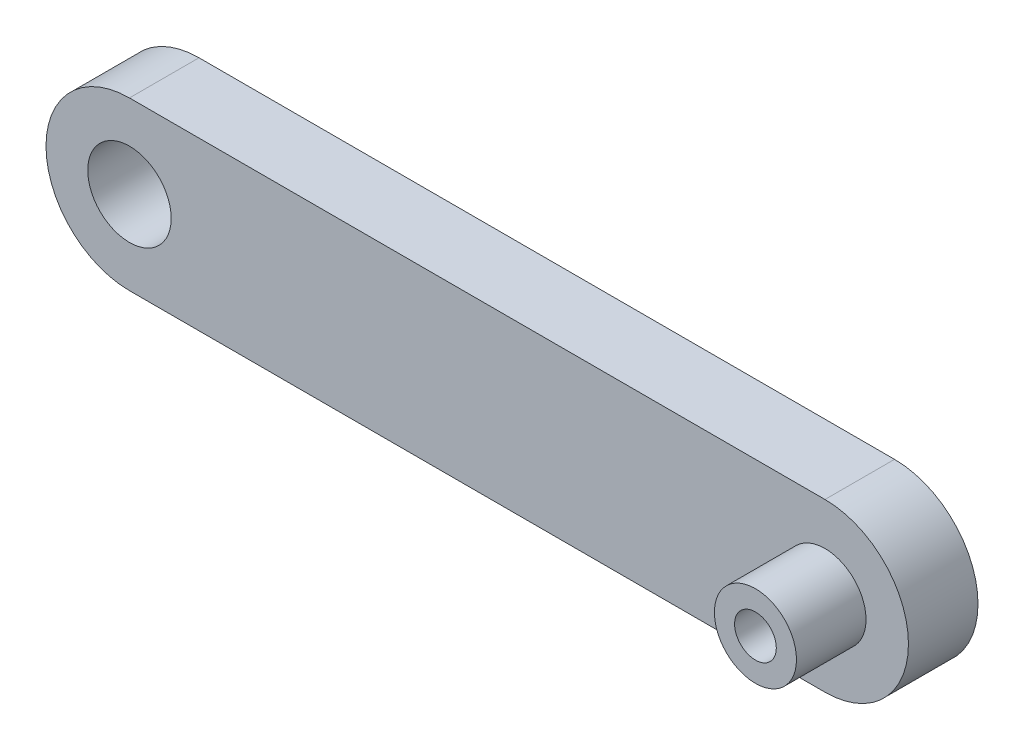
ISO-10303-21;
HEADER;
FILE_DESCRIPTION(('STEP AP214'),'2;1');
FILE_NAME('part.step','',(''),(''),'','','');
FILE_SCHEMA(('AUTOMOTIVE_DESIGN { 1 0 10303 214 1 1 1 1 }'));
ENDSEC;
DATA;
#1=APPLICATION_CONTEXT('core data for automotive mechanical design processes');
#2=APPLICATION_PROTOCOL_DEFINITION('international standard','automotive_design',2000,#1);
#3=PRODUCT_CONTEXT('',#1,'mechanical');
#4=PRODUCT('Part','Part','',(#3));
#5=PRODUCT_RELATED_PRODUCT_CATEGORY('part','',(#4));
#6=PRODUCT_DEFINITION_FORMATION('','',#4);
#7=PRODUCT_DEFINITION_CONTEXT('part definition',#1,'design');
#8=PRODUCT_DEFINITION('design','',#6,#7);
#9=PRODUCT_DEFINITION_SHAPE('','',#8);
#10=(LENGTH_UNIT() NAMED_UNIT(*) SI_UNIT(.MILLI.,.METRE.));
#11=(NAMED_UNIT(*) PLANE_ANGLE_UNIT() SI_UNIT($,.RADIAN.));
#12=(NAMED_UNIT(*) SI_UNIT($,.STERADIAN.) SOLID_ANGLE_UNIT());
#13=UNCERTAINTY_MEASURE_WITH_UNIT(LENGTH_MEASURE(1.E-05),#10,'distance_accuracy_value','');
#14=(GEOMETRIC_REPRESENTATION_CONTEXT(3) GLOBAL_UNCERTAINTY_ASSIGNED_CONTEXT((#13)) GLOBAL_UNIT_ASSIGNED_CONTEXT((#10,
#11,#12)) REPRESENTATION_CONTEXT('',''));
#15=CARTESIAN_POINT('',(0.,0.,0.));
#16=DIRECTION('',(0.,0.,1.));
#17=DIRECTION('',(1.,0.,0.));
#18=AXIS2_PLACEMENT_3D('',#15,#16,#17);
#19=CARTESIAN_POINT('',(-25.,0.,5.));
#20=DIRECTION('',(0.,0.,1.));
#21=DIRECTION('',(1.,0.,0.));
#22=AXIS2_PLACEMENT_3D('',#19,#20,#21);
#23=PLANE('',#22);
#24=CARTESIAN_POINT('',(-25.,0.,5.));
#25=DIRECTION('',(0.,0.,1.));
#26=DIRECTION('',(1.,0.,0.));
#27=AXIS2_PLACEMENT_3D('',#24,#25,#26);
#28=CIRCLE('',#27,3.);
#29=CARTESIAN_POINT('',(-22.,0.,5.));
#30=VERTEX_POINT('',#29);
#31=EDGE_CURVE('E114',#30,#30,#28,.T.);
#32=ORIENTED_EDGE('',*,*,#31,.F.);
#33=EDGE_LOOP('',(#32));
#34=FACE_BOUND('',#33,.T.);
#35=CARTESIAN_POINT('',(-25.,0.,5.));
#36=DIRECTION('',(0.,0.,1.));
#37=DIRECTION('',(1.,0.,0.));
#38=AXIS2_PLACEMENT_3D('',#35,#36,#37);
#39=CIRCLE('',#38,6.00000000000001);
#40=CARTESIAN_POINT('',(-25.,6.00000000000001,5.));
#41=VERTEX_POINT('',#40);
#42=CARTESIAN_POINT('',(-25.,-6.00000000000001,5.));
#43=VERTEX_POINT('',#42);
#44=EDGE_CURVE('E85',#41,#43,#39,.T.);
#45=ORIENTED_EDGE('',*,*,#44,.T.);
#46=DIRECTION('',(1.,0.,0.));
#47=VECTOR('',#46,1.);
#48=CARTESIAN_POINT('',(-25.,-6.00000000000001,5.));
#49=LINE('',#48,#47);
#50=CARTESIAN_POINT('',(25.,-6.,5.));
#51=VERTEX_POINT('',#50);
#52=EDGE_CURVE('E80',#43,#51,#49,.T.);
#53=ORIENTED_EDGE('',*,*,#52,.T.);
#54=CARTESIAN_POINT('',(25.,0.,5.));
#55=DIRECTION('',(0.,0.,1.));
#56=DIRECTION('',(1.,0.,0.));
#57=AXIS2_PLACEMENT_3D('',#54,#55,#56);
#58=CIRCLE('',#57,6.00000000000001);
#59=CARTESIAN_POINT('',(25.,6.00000000000002,5.));
#60=VERTEX_POINT('',#59);
#61=EDGE_CURVE('E83',#51,#60,#58,.T.);
#62=ORIENTED_EDGE('',*,*,#61,.T.);
#63=DIRECTION('',(-1.,0.,0.));
#64=VECTOR('',#63,1.);
#65=CARTESIAN_POINT('',(-25.,6.00000000000001,5.));
#66=LINE('',#65,#64);
#67=EDGE_CURVE('E50',#60,#41,#66,.T.);
#68=ORIENTED_EDGE('',*,*,#67,.T.);
#69=EDGE_LOOP('',(#45,#53,#62,#68));
#70=FACE_BOUND('',#69,.T.);
#71=CARTESIAN_POINT('',(25.,0.,5.));
#72=DIRECTION('',(0.,0.,1.));
#73=DIRECTION('',(1.,0.,0.));
#74=AXIS2_PLACEMENT_3D('',#71,#72,#73);
#75=CIRCLE('',#74,2.95);
#76=CARTESIAN_POINT('',(27.95,0.,5.));
#77=VERTEX_POINT('',#76);
#78=EDGE_CURVE('E121',#77,#77,#75,.T.);
#79=ORIENTED_EDGE('',*,*,#78,.F.);
#80=EDGE_LOOP('',(#79));
#81=FACE_BOUND('',#80,.T.);
#82=ADVANCED_FACE('F33',(#34,#70,#81),#23,.T.);
#83=CARTESIAN_POINT('',(-25.,0.,0.));
#84=DIRECTION('',(0.,0.,1.));
#85=DIRECTION('',(1.,0.,0.));
#86=AXIS2_PLACEMENT_3D('',#83,#84,#85);
#87=PLANE('',#86);
#88=CARTESIAN_POINT('',(25.,0.,0.));
#89=DIRECTION('',(0.,0.,1.));
#90=DIRECTION('',(1.,0.,0.));
#91=AXIS2_PLACEMENT_3D('',#88,#89,#90);
#92=CIRCLE('',#91,1.5);
#93=CARTESIAN_POINT('',(26.5,0.,0.));
#94=VERTEX_POINT('',#93);
#95=EDGE_CURVE('E100',#94,#94,#92,.T.);
#96=ORIENTED_EDGE('',*,*,#95,.T.);
#97=EDGE_LOOP('',(#96));
#98=FACE_BOUND('',#97,.T.);
#99=CARTESIAN_POINT('',(-25.,0.,0.));
#100=DIRECTION('',(0.,0.,1.));
#101=DIRECTION('',(1.,0.,0.));
#102=AXIS2_PLACEMENT_3D('',#99,#100,#101);
#103=CIRCLE('',#102,6.00000000000001);
#104=CARTESIAN_POINT('',(-25.,6.00000000000001,0.));
#105=VERTEX_POINT('',#104);
#106=CARTESIAN_POINT('',(-25.,-6.00000000000001,0.));
#107=VERTEX_POINT('',#106);
#108=EDGE_CURVE('E97',#105,#107,#103,.T.);
#109=ORIENTED_EDGE('',*,*,#108,.F.);
#110=DIRECTION('',(-1.,0.,0.));
#111=VECTOR('',#110,1.);
#112=CARTESIAN_POINT('',(-25.,6.00000000000001,0.));
#113=LINE('',#112,#111);
#114=CARTESIAN_POINT('',(25.,6.00000000000002,0.));
#115=VERTEX_POINT('',#114);
#116=EDGE_CURVE('E73',#115,#105,#113,.T.);
#117=ORIENTED_EDGE('',*,*,#116,.F.);
#118=CARTESIAN_POINT('',(25.,0.,0.));
#119=DIRECTION('',(0.,0.,1.));
#120=DIRECTION('',(1.,0.,0.));
#121=AXIS2_PLACEMENT_3D('',#118,#119,#120);
#122=CIRCLE('',#121,6.00000000000001);
#123=CARTESIAN_POINT('',(25.,-6.,0.));
#124=VERTEX_POINT('',#123);
#125=EDGE_CURVE('E67',#124,#115,#122,.T.);
#126=ORIENTED_EDGE('',*,*,#125,.F.);
#127=DIRECTION('',(1.,0.,0.));
#128=VECTOR('',#127,1.);
#129=CARTESIAN_POINT('',(-25.,-6.00000000000001,0.));
#130=LINE('',#129,#128);
#131=EDGE_CURVE('E89',#107,#124,#130,.T.);
#132=ORIENTED_EDGE('',*,*,#131,.F.);
#133=EDGE_LOOP('',(#109,#117,#126,#132));
#134=FACE_BOUND('',#133,.T.);
#135=CARTESIAN_POINT('',(-25.,0.,0.));
#136=DIRECTION('',(0.,0.,1.));
#137=DIRECTION('',(1.,0.,0.));
#138=AXIS2_PLACEMENT_3D('',#135,#136,#137);
#139=CIRCLE('',#138,3.);
#140=CARTESIAN_POINT('',(-22.,0.,0.));
#141=VERTEX_POINT('',#140);
#142=EDGE_CURVE('E115',#141,#141,#139,.T.);
#143=ORIENTED_EDGE('',*,*,#142,.T.);
#144=EDGE_LOOP('',(#143));
#145=FACE_BOUND('',#144,.T.);
#146=ADVANCED_FACE('F108',(#98,#134,#145),#87,.F.);
#147=CARTESIAN_POINT('',(-25.,0.,5.));
#148=DIRECTION('',(0.,0.,-1.));
#149=DIRECTION('',(-1.,0.,0.));
#150=AXIS2_PLACEMENT_3D('',#147,#148,#149);
#151=CYLINDRICAL_SURFACE('',#150,6.00000000000001);
#152=ORIENTED_EDGE('',*,*,#108,.T.);
#153=DIRECTION('',(0.,0.,-1.));
#154=VECTOR('',#153,1.);
#155=CARTESIAN_POINT('',(-25.,-6.00000000000001,5.));
#156=LINE('',#155,#154);
#157=EDGE_CURVE('E11',#43,#107,#156,.T.);
#158=ORIENTED_EDGE('',*,*,#157,.F.);
#159=ORIENTED_EDGE('',*,*,#44,.F.);
#160=DIRECTION('',(0.,0.,-1.));
#161=VECTOR('',#160,1.);
#162=CARTESIAN_POINT('',(-25.,6.00000000000001,5.));
#163=LINE('',#162,#161);
#164=EDGE_CURVE('E93',#41,#105,#163,.T.);
#165=ORIENTED_EDGE('',*,*,#164,.T.);
#166=EDGE_LOOP('',(#152,#158,#159,#165));
#167=FACE_BOUND('',#166,.T.);
#168=ADVANCED_FACE('F35',(#167),#151,.T.);
#169=CARTESIAN_POINT('',(-25.,-6.00000000000001,5.));
#170=DIRECTION('',(0.,1.,0.));
#171=DIRECTION('',(-1.,0.,0.));
#172=AXIS2_PLACEMENT_3D('',#169,#170,#171);
#173=PLANE('',#172);
#174=ORIENTED_EDGE('',*,*,#131,.T.);
#175=DIRECTION('',(0.,0.,-1.));
#176=VECTOR('',#175,1.);
#177=CARTESIAN_POINT('',(25.,-6.,5.));
#178=LINE('',#177,#176);
#179=EDGE_CURVE('E42',#51,#124,#178,.T.);
#180=ORIENTED_EDGE('',*,*,#179,.F.);
#181=ORIENTED_EDGE('',*,*,#52,.F.);
#182=ORIENTED_EDGE('',*,*,#157,.T.);
#183=EDGE_LOOP('',(#174,#180,#181,#182));
#184=FACE_BOUND('',#183,.T.);
#185=ADVANCED_FACE('F88',(#184),#173,.F.);
#186=CARTESIAN_POINT('',(25.,0.,5.));
#187=DIRECTION('',(0.,0.,-1.));
#188=DIRECTION('',(-1.,0.,0.));
#189=AXIS2_PLACEMENT_3D('',#186,#187,#188);
#190=CYLINDRICAL_SURFACE('',#189,6.00000000000001);
#191=ORIENTED_EDGE('',*,*,#125,.T.);
#192=DIRECTION('',(0.,0.,-1.));
#193=VECTOR('',#192,1.);
#194=CARTESIAN_POINT('',(25.,6.00000000000002,5.));
#195=LINE('',#194,#193);
#196=EDGE_CURVE('E90',#60,#115,#195,.T.);
#197=ORIENTED_EDGE('',*,*,#196,.F.);
#198=ORIENTED_EDGE('',*,*,#61,.F.);
#199=ORIENTED_EDGE('',*,*,#179,.T.);
#200=EDGE_LOOP('',(#191,#197,#198,#199));
#201=FACE_BOUND('',#200,.T.);
#202=ADVANCED_FACE('F91',(#201),#190,.T.);
#203=CARTESIAN_POINT('',(-25.,6.00000000000001,5.));
#204=DIRECTION('',(0.,-1.,0.));
#205=DIRECTION('',(1.,0.,0.));
#206=AXIS2_PLACEMENT_3D('',#203,#204,#205);
#207=PLANE('',#206);
#208=ORIENTED_EDGE('',*,*,#116,.T.);
#209=ORIENTED_EDGE('',*,*,#164,.F.);
#210=ORIENTED_EDGE('',*,*,#67,.F.);
#211=ORIENTED_EDGE('',*,*,#196,.T.);
#212=EDGE_LOOP('',(#208,#209,#210,#211));
#213=FACE_BOUND('',#212,.T.);
#214=ADVANCED_FACE('F105',(#213),#207,.F.);
#215=CARTESIAN_POINT('',(25.,0.,5.));
#216=DIRECTION('',(0.,0.,-1.));
#217=DIRECTION('',(-1.,0.,0.));
#218=AXIS2_PLACEMENT_3D('',#215,#216,#217);
#219=CYLINDRICAL_SURFACE('',#218,1.5);
#220=ORIENTED_EDGE('',*,*,#95,.F.);
#221=EDGE_LOOP('',(#220));
#222=FACE_BOUND('',#221,.T.);
#223=CARTESIAN_POINT('',(25.,0.,10.));
#224=DIRECTION('',(0.,0.,1.));
#225=DIRECTION('',(1.,0.,0.));
#226=AXIS2_PLACEMENT_3D('',#223,#224,#225);
#227=CIRCLE('',#226,1.5);
#228=CARTESIAN_POINT('',(26.5,0.,10.));
#229=VERTEX_POINT('',#228);
#230=EDGE_CURVE('E124',#229,#229,#227,.T.);
#231=ORIENTED_EDGE('',*,*,#230,.T.);
#232=EDGE_LOOP('',(#231));
#233=FACE_BOUND('',#232,.T.);
#234=ADVANCED_FACE('F130',(#222,#233),#219,.F.);
#235=CARTESIAN_POINT('',(-25.,0.,5.));
#236=DIRECTION('',(0.,0.,-1.));
#237=DIRECTION('',(-1.,0.,0.));
#238=AXIS2_PLACEMENT_3D('',#235,#236,#237);
#239=CYLINDRICAL_SURFACE('',#238,3.);
#240=ORIENTED_EDGE('',*,*,#31,.T.);
#241=EDGE_LOOP('',(#240));
#242=FACE_BOUND('',#241,.T.);
#243=ORIENTED_EDGE('',*,*,#142,.F.);
#244=EDGE_LOOP('',(#243));
#245=FACE_BOUND('',#244,.T.);
#246=ADVANCED_FACE('F135',(#242,#245),#239,.F.);
#247=CARTESIAN_POINT('',(25.,0.,10.));
#248=DIRECTION('',(0.,0.,1.));
#249=DIRECTION('',(1.,0.,0.));
#250=AXIS2_PLACEMENT_3D('',#247,#248,#249);
#251=PLANE('',#250);
#252=CARTESIAN_POINT('',(25.,0.,10.));
#253=DIRECTION('',(0.,0.,1.));
#254=DIRECTION('',(1.,0.,0.));
#255=AXIS2_PLACEMENT_3D('',#252,#253,#254);
#256=CIRCLE('',#255,2.95);
#257=CARTESIAN_POINT('',(27.95,0.,10.));
#258=VERTEX_POINT('',#257);
#259=EDGE_CURVE('E118',#258,#258,#256,.T.);
#260=ORIENTED_EDGE('',*,*,#259,.T.);
#261=EDGE_LOOP('',(#260));
#262=FACE_BOUND('',#261,.T.);
#263=ORIENTED_EDGE('',*,*,#230,.F.);
#264=EDGE_LOOP('',(#263));
#265=FACE_BOUND('',#264,.T.);
#266=ADVANCED_FACE('F132',(#262,#265),#251,.T.);
#267=CARTESIAN_POINT('',(25.,0.,10.));
#268=DIRECTION('',(0.,0.,-1.));
#269=DIRECTION('',(-1.,0.,0.));
#270=AXIS2_PLACEMENT_3D('',#267,#268,#269);
#271=CYLINDRICAL_SURFACE('',#270,2.95);
#272=ORIENTED_EDGE('',*,*,#259,.F.);
#273=EDGE_LOOP('',(#272));
#274=FACE_BOUND('',#273,.T.);
#275=ORIENTED_EDGE('',*,*,#78,.T.);
#276=EDGE_LOOP('',(#275));
#277=FACE_BOUND('',#276,.T.);
#278=ADVANCED_FACE('F134',(#274,#277),#271,.T.);
#279=CLOSED_SHELL('',(#82,#146,#168,#185,#202,#214,#234,#246,#266,#278));
#280=MANIFOLD_SOLID_BREP('B2',#279);
#281=ADVANCED_BREP_SHAPE_REPRESENTATION('',(#18,#280),#14);
#282=SHAPE_DEFINITION_REPRESENTATION(#9,#281);
ENDSEC;
END-ISO-10303-21;
